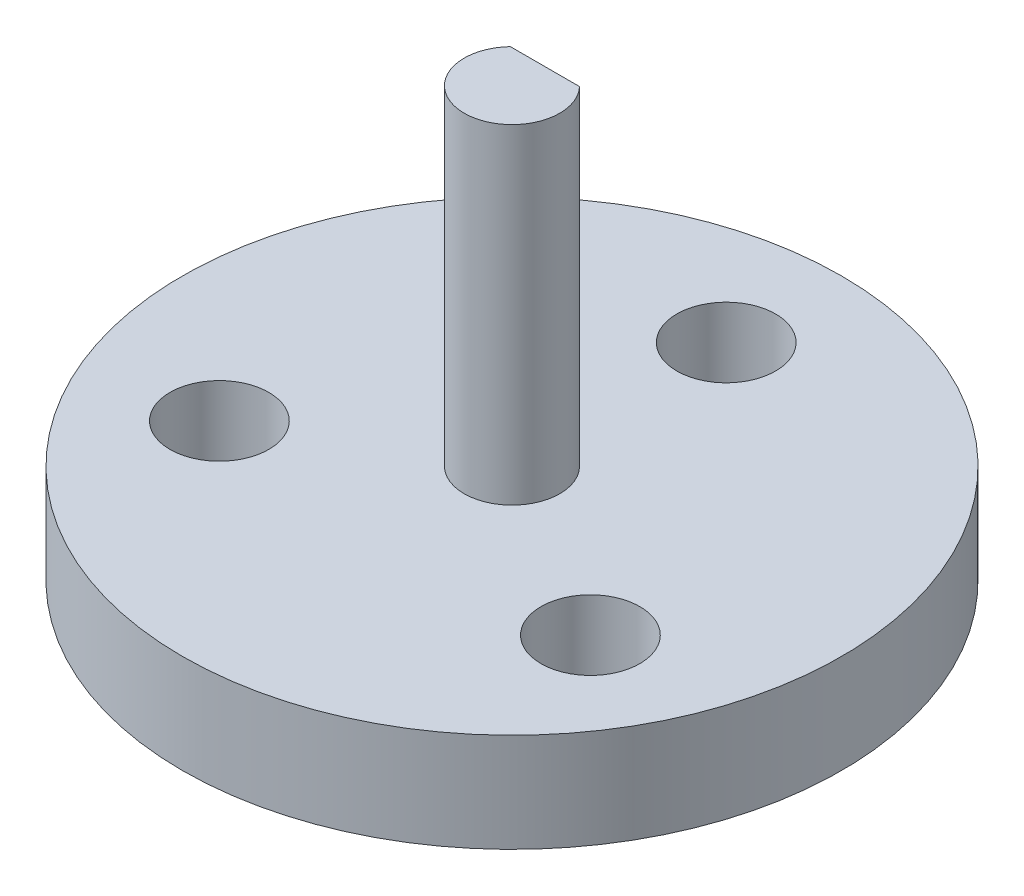
ISO-10303-21;
HEADER;
FILE_DESCRIPTION(('STEP AP214'),'2;1');
FILE_NAME('part.step','',(''),(''),'','','');
FILE_SCHEMA(('AUTOMOTIVE_DESIGN { 1 0 10303 214 1 1 1 1 }'));
ENDSEC;
DATA;
#1=APPLICATION_CONTEXT('core data for automotive mechanical design processes');
#2=APPLICATION_PROTOCOL_DEFINITION('international standard','automotive_design',2000,#1);
#3=PRODUCT_CONTEXT('',#1,'mechanical');
#4=PRODUCT('Part','Part','',(#3));
#5=PRODUCT_RELATED_PRODUCT_CATEGORY('part','',(#4));
#6=PRODUCT_DEFINITION_FORMATION('','',#4);
#7=PRODUCT_DEFINITION_CONTEXT('part definition',#1,'design');
#8=PRODUCT_DEFINITION('design','',#6,#7);
#9=PRODUCT_DEFINITION_SHAPE('','',#8);
#10=(LENGTH_UNIT() NAMED_UNIT(*) SI_UNIT(.MILLI.,.METRE.));
#11=(NAMED_UNIT(*) PLANE_ANGLE_UNIT() SI_UNIT($,.RADIAN.));
#12=(NAMED_UNIT(*) SI_UNIT($,.STERADIAN.) SOLID_ANGLE_UNIT());
#13=UNCERTAINTY_MEASURE_WITH_UNIT(LENGTH_MEASURE(1.E-05),#10,'distance_accuracy_value','');
#14=(GEOMETRIC_REPRESENTATION_CONTEXT(3) GLOBAL_UNCERTAINTY_ASSIGNED_CONTEXT((#13)) GLOBAL_UNIT_ASSIGNED_CONTEXT((#10,
#11,#12)) REPRESENTATION_CONTEXT('',''));
#15=CARTESIAN_POINT('',(0.,0.,0.));
#16=DIRECTION('',(0.,0.,1.));
#17=DIRECTION('',(1.,0.,0.));
#18=AXIS2_PLACEMENT_3D('',#15,#16,#17);
#19=CARTESIAN_POINT('',(0.,3.,0.));
#20=DIRECTION('',(0.,1.,0.));
#21=DIRECTION('',(0.,0.,1.));
#22=AXIS2_PLACEMENT_3D('',#19,#20,#21);
#23=PLANE('',#22);
#24=CARTESIAN_POINT('',(5.62916512459884,3.,3.25000000000003));
#25=DIRECTION('',(0.,1.,0.));
#26=DIRECTION('',(0.,0.,1.));
#27=AXIS2_PLACEMENT_3D('',#24,#25,#26);
#28=CIRCLE('',#27,1.5);
#29=CARTESIAN_POINT('',(5.62916512459884,3.,4.75000000000003));
#30=VERTEX_POINT('',#29);
#31=EDGE_CURVE('E106',#30,#30,#28,.T.);
#32=ORIENTED_EDGE('',*,*,#31,.F.);
#33=EDGE_LOOP('',(#32));
#34=FACE_BOUND('',#33,.T.);
#35=CARTESIAN_POINT('',(0.,3.,0.));
#36=DIRECTION('',(0.,1.,0.));
#37=DIRECTION('',(0.,0.,1.));
#38=AXIS2_PLACEMENT_3D('',#35,#36,#37);
#39=CIRCLE('',#38,10.);
#40=CARTESIAN_POINT('',(0.,3.,10.));
#41=VERTEX_POINT('',#40);
#42=EDGE_CURVE('E11',#41,#41,#39,.T.);
#43=ORIENTED_EDGE('',*,*,#42,.T.);
#44=EDGE_LOOP('',(#43));
#45=FACE_BOUND('',#44,.T.);
#46=CARTESIAN_POINT('',(0.,3.,-6.5));
#47=DIRECTION('',(0.,1.,0.));
#48=DIRECTION('',(0.,0.,1.));
#49=AXIS2_PLACEMENT_3D('',#46,#47,#48);
#50=CIRCLE('',#49,1.5);
#51=CARTESIAN_POINT('',(0.,3.,-5.));
#52=VERTEX_POINT('',#51);
#53=EDGE_CURVE('E114',#52,#52,#50,.T.);
#54=ORIENTED_EDGE('',*,*,#53,.F.);
#55=EDGE_LOOP('',(#54));
#56=FACE_BOUND('',#55,.T.);
#57=CARTESIAN_POINT('',(-5.62916512459888,3.,3.24999999999995));
#58=DIRECTION('',(0.,1.,0.));
#59=DIRECTION('',(0.,0.,1.));
#60=AXIS2_PLACEMENT_3D('',#57,#58,#59);
#61=CIRCLE('',#60,1.5);
#62=CARTESIAN_POINT('',(-5.62916512459888,3.,4.74999999999995));
#63=VERTEX_POINT('',#62);
#64=EDGE_CURVE('E98',#63,#63,#61,.T.);
#65=ORIENTED_EDGE('',*,*,#64,.F.);
#66=EDGE_LOOP('',(#65));
#67=FACE_BOUND('',#66,.T.);
#68=DIRECTION('',(1.,0.,0.));
#69=VECTOR('',#68,1.);
#70=CARTESIAN_POINT('',(0.,3.,-1.));
#71=LINE('',#70,#69);
#72=CARTESIAN_POINT('',(-1.05,3.,-1.));
#73=VERTEX_POINT('',#72);
#74=CARTESIAN_POINT('',(1.05,3.,-1.));
#75=VERTEX_POINT('',#74);
#76=EDGE_CURVE('E66',#73,#75,#71,.T.);
#77=ORIENTED_EDGE('',*,*,#76,.T.);
#78=CARTESIAN_POINT('',(0.,3.,0.));
#79=DIRECTION('',(0.,1.,0.));
#80=DIRECTION('',(0.,0.,1.));
#81=AXIS2_PLACEMENT_3D('',#78,#79,#80);
#82=CIRCLE('',#81,1.45);
#83=EDGE_CURVE('E87',#75,#73,#82,.F.);
#84=ORIENTED_EDGE('',*,*,#83,.T.);
#85=EDGE_LOOP('',(#77,#84));
#86=FACE_BOUND('',#85,.T.);
#87=ADVANCED_FACE('F45',(#34,#45,#56,#67,#86),#23,.T.);
#88=CARTESIAN_POINT('',(0.,0.,0.));
#89=DIRECTION('',(0.,1.,0.));
#90=DIRECTION('',(0.,0.,1.));
#91=AXIS2_PLACEMENT_3D('',#88,#89,#90);
#92=PLANE('',#91);
#93=CARTESIAN_POINT('',(-5.62916512459888,0.,3.24999999999995));
#94=DIRECTION('',(0.,1.,0.));
#95=DIRECTION('',(0.,0.,1.));
#96=AXIS2_PLACEMENT_3D('',#93,#94,#95);
#97=CIRCLE('',#96,1.5);
#98=CARTESIAN_POINT('',(-5.62916512459888,0.,4.74999999999995));
#99=VERTEX_POINT('',#98);
#100=EDGE_CURVE('E97',#99,#99,#97,.T.);
#101=ORIENTED_EDGE('',*,*,#100,.T.);
#102=EDGE_LOOP('',(#101));
#103=FACE_BOUND('',#102,.T.);
#104=CARTESIAN_POINT('',(5.62916512459884,0.,3.25000000000003));
#105=DIRECTION('',(0.,1.,0.));
#106=DIRECTION('',(0.,0.,1.));
#107=AXIS2_PLACEMENT_3D('',#104,#105,#106);
#108=CIRCLE('',#107,1.5);
#109=CARTESIAN_POINT('',(5.62916512459884,0.,4.75000000000003));
#110=VERTEX_POINT('',#109);
#111=EDGE_CURVE('E102',#110,#110,#108,.T.);
#112=ORIENTED_EDGE('',*,*,#111,.T.);
#113=EDGE_LOOP('',(#112));
#114=FACE_BOUND('',#113,.T.);
#115=CARTESIAN_POINT('',(0.,0.,-6.5));
#116=DIRECTION('',(0.,1.,0.));
#117=DIRECTION('',(0.,0.,1.));
#118=AXIS2_PLACEMENT_3D('',#115,#116,#117);
#119=CIRCLE('',#118,1.5);
#120=CARTESIAN_POINT('',(0.,0.,-5.));
#121=VERTEX_POINT('',#120);
#122=EDGE_CURVE('E110',#121,#121,#119,.T.);
#123=ORIENTED_EDGE('',*,*,#122,.T.);
#124=EDGE_LOOP('',(#123));
#125=FACE_BOUND('',#124,.T.);
#126=CARTESIAN_POINT('',(0.,0.,0.));
#127=DIRECTION('',(0.,1.,0.));
#128=DIRECTION('',(0.,0.,1.));
#129=AXIS2_PLACEMENT_3D('',#126,#127,#128);
#130=CIRCLE('',#129,10.);
#131=CARTESIAN_POINT('',(0.,0.,10.));
#132=VERTEX_POINT('',#131);
#133=EDGE_CURVE('E49',#132,#132,#130,.T.);
#134=ORIENTED_EDGE('',*,*,#133,.F.);
#135=EDGE_LOOP('',(#134));
#136=FACE_BOUND('',#135,.T.);
#137=ADVANCED_FACE('F122',(#103,#114,#125,#136),#92,.F.);
#138=CARTESIAN_POINT('',(0.,3.,0.));
#139=DIRECTION('',(0.,-1.,0.));
#140=DIRECTION('',(0.,0.,-1.));
#141=AXIS2_PLACEMENT_3D('',#138,#139,#140);
#142=CYLINDRICAL_SURFACE('',#141,10.);
#143=ORIENTED_EDGE('',*,*,#42,.F.);
#144=EDGE_LOOP('',(#143));
#145=FACE_BOUND('',#144,.T.);
#146=ORIENTED_EDGE('',*,*,#133,.T.);
#147=EDGE_LOOP('',(#146));
#148=FACE_BOUND('',#147,.T.);
#149=ADVANCED_FACE('F47',(#145,#148),#142,.T.);
#150=CARTESIAN_POINT('',(0.,3.,-6.5));
#151=DIRECTION('',(0.,-1.,0.));
#152=DIRECTION('',(0.,0.,-1.));
#153=AXIS2_PLACEMENT_3D('',#150,#151,#152);
#154=CYLINDRICAL_SURFACE('',#153,1.5);
#155=ORIENTED_EDGE('',*,*,#53,.T.);
#156=EDGE_LOOP('',(#155));
#157=FACE_BOUND('',#156,.T.);
#158=ORIENTED_EDGE('',*,*,#122,.F.);
#159=EDGE_LOOP('',(#158));
#160=FACE_BOUND('',#159,.T.);
#161=ADVANCED_FACE('F125',(#157,#160),#154,.F.);
#162=CARTESIAN_POINT('',(5.62916512459884,3.,3.25000000000003));
#163=DIRECTION('',(0.,-1.,0.));
#164=DIRECTION('',(0.,0.,-1.));
#165=AXIS2_PLACEMENT_3D('',#162,#163,#164);
#166=CYLINDRICAL_SURFACE('',#165,1.5);
#167=ORIENTED_EDGE('',*,*,#31,.T.);
#168=EDGE_LOOP('',(#167));
#169=FACE_BOUND('',#168,.T.);
#170=ORIENTED_EDGE('',*,*,#111,.F.);
#171=EDGE_LOOP('',(#170));
#172=FACE_BOUND('',#171,.T.);
#173=ADVANCED_FACE('F127',(#169,#172),#166,.F.);
#174=CARTESIAN_POINT('',(-5.62916512459888,3.,3.24999999999995));
#175=DIRECTION('',(0.,-1.,0.));
#176=DIRECTION('',(0.,0.,-1.));
#177=AXIS2_PLACEMENT_3D('',#174,#175,#176);
#178=CYLINDRICAL_SURFACE('',#177,1.5);
#179=ORIENTED_EDGE('',*,*,#64,.T.);
#180=EDGE_LOOP('',(#179));
#181=FACE_BOUND('',#180,.T.);
#182=ORIENTED_EDGE('',*,*,#100,.F.);
#183=EDGE_LOOP('',(#182));
#184=FACE_BOUND('',#183,.T.);
#185=ADVANCED_FACE('F134',(#181,#184),#178,.F.);
#186=CARTESIAN_POINT('',(0.,13.,0.));
#187=DIRECTION('',(0.,-1.,0.));
#188=DIRECTION('',(0.,0.,-1.));
#189=AXIS2_PLACEMENT_3D('',#186,#187,#188);
#190=CYLINDRICAL_SURFACE('',#189,1.45);
#191=ORIENTED_EDGE('',*,*,#83,.F.);
#192=DIRECTION('',(0.,-1.,0.));
#193=VECTOR('',#192,1.);
#194=CARTESIAN_POINT('',(1.05,13.,-1.));
#195=LINE('',#194,#193);
#196=CARTESIAN_POINT('',(1.05,13.,-1.));
#197=VERTEX_POINT('',#196);
#198=EDGE_CURVE('E61',#197,#75,#195,.T.);
#199=ORIENTED_EDGE('',*,*,#198,.F.);
#200=CARTESIAN_POINT('',(0.,13.,0.));
#201=DIRECTION('',(0.,1.,0.));
#202=DIRECTION('',(0.,0.,1.));
#203=AXIS2_PLACEMENT_3D('',#200,#201,#202);
#204=CIRCLE('',#203,1.45);
#205=CARTESIAN_POINT('',(-1.05,13.,-1.));
#206=VERTEX_POINT('',#205);
#207=EDGE_CURVE('E79',#206,#197,#204,.T.);
#208=ORIENTED_EDGE('',*,*,#207,.F.);
#209=DIRECTION('',(0.,-1.,0.));
#210=VECTOR('',#209,1.);
#211=CARTESIAN_POINT('',(-1.05,13.,-1.));
#212=LINE('',#211,#210);
#213=EDGE_CURVE('E75',#206,#73,#212,.T.);
#214=ORIENTED_EDGE('',*,*,#213,.T.);
#215=EDGE_LOOP('',(#191,#199,#208,#214));
#216=FACE_BOUND('',#215,.T.);
#217=ADVANCED_FACE('F85',(#216),#190,.T.);
#218=CARTESIAN_POINT('',(-1.05,13.,-1.));
#219=DIRECTION('',(0.,0.,1.));
#220=DIRECTION('',(1.,0.,0.));
#221=AXIS2_PLACEMENT_3D('',#218,#219,#220);
#222=PLANE('',#221);
#223=ORIENTED_EDGE('',*,*,#76,.F.);
#224=ORIENTED_EDGE('',*,*,#213,.F.);
#225=DIRECTION('',(-1.,0.,0.));
#226=VECTOR('',#225,1.);
#227=CARTESIAN_POINT('',(-1.05,13.,-1.));
#228=LINE('',#227,#226);
#229=EDGE_CURVE('E72',#197,#206,#228,.T.);
#230=ORIENTED_EDGE('',*,*,#229,.F.);
#231=ORIENTED_EDGE('',*,*,#198,.T.);
#232=EDGE_LOOP('',(#223,#224,#230,#231));
#233=FACE_BOUND('',#232,.T.);
#234=ADVANCED_FACE('F74',(#233),#222,.F.);
#235=CARTESIAN_POINT('',(0.,13.,0.));
#236=DIRECTION('',(0.,1.,0.));
#237=DIRECTION('',(0.,0.,1.));
#238=AXIS2_PLACEMENT_3D('',#235,#236,#237);
#239=PLANE('',#238);
#240=ORIENTED_EDGE('',*,*,#207,.T.);
#241=ORIENTED_EDGE('',*,*,#229,.T.);
#242=EDGE_LOOP('',(#240,#241));
#243=FACE_BOUND('',#242,.T.);
#244=ADVANCED_FACE('F81',(#243),#239,.T.);
#245=CLOSED_SHELL('',(#87,#137,#149,#161,#173,#185,#217,#234,#244));
#246=MANIFOLD_SOLID_BREP('B2',#245);
#247=ADVANCED_BREP_SHAPE_REPRESENTATION('',(#18,#246),#14);
#248=SHAPE_DEFINITION_REPRESENTATION(#9,#247);
ENDSEC;
END-ISO-10303-21;
